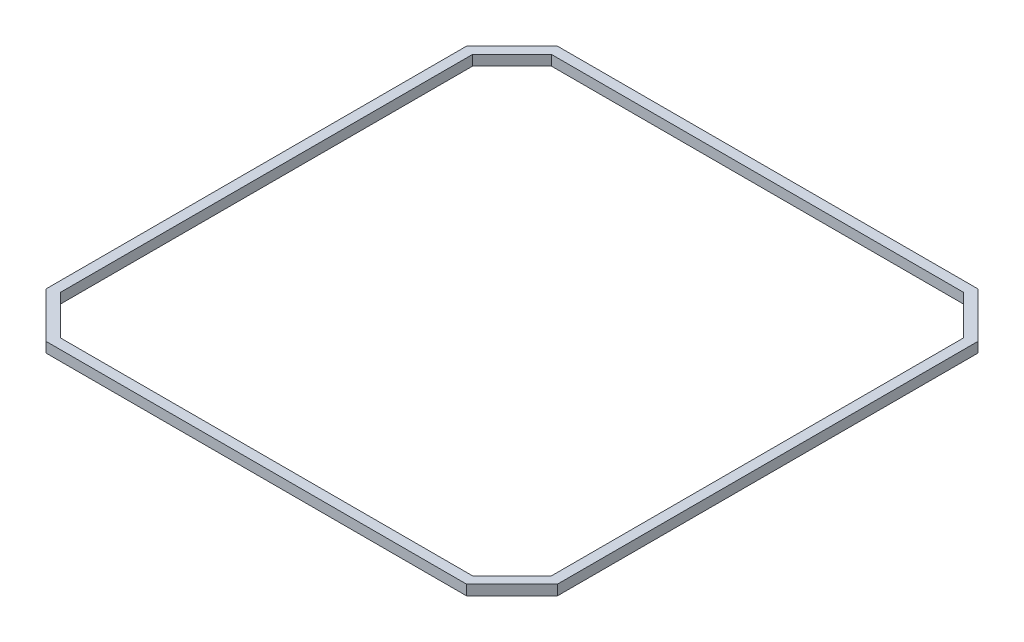
ISO-10303-21;
HEADER;
FILE_DESCRIPTION(('STEP AP214'),'2;1');
FILE_NAME('part.step','',(''),(''),'','','');
FILE_SCHEMA(('AUTOMOTIVE_DESIGN { 1 0 10303 214 1 1 1 1 }'));
ENDSEC;
DATA;
#1=APPLICATION_CONTEXT('core data for automotive mechanical design processes');
#2=APPLICATION_PROTOCOL_DEFINITION('international standard','automotive_design',2000,#1);
#3=PRODUCT_CONTEXT('',#1,'mechanical');
#4=PRODUCT('Part','Part','',(#3));
#5=PRODUCT_RELATED_PRODUCT_CATEGORY('part','',(#4));
#6=PRODUCT_DEFINITION_FORMATION('','',#4);
#7=PRODUCT_DEFINITION_CONTEXT('part definition',#1,'design');
#8=PRODUCT_DEFINITION('design','',#6,#7);
#9=PRODUCT_DEFINITION_SHAPE('','',#8);
#10=(LENGTH_UNIT() NAMED_UNIT(*) SI_UNIT(.MILLI.,.METRE.));
#11=(NAMED_UNIT(*) PLANE_ANGLE_UNIT() SI_UNIT($,.RADIAN.));
#12=(NAMED_UNIT(*) SI_UNIT($,.STERADIAN.) SOLID_ANGLE_UNIT());
#13=UNCERTAINTY_MEASURE_WITH_UNIT(LENGTH_MEASURE(1.E-05),#10,'distance_accuracy_value','');
#14=(GEOMETRIC_REPRESENTATION_CONTEXT(3) GLOBAL_UNCERTAINTY_ASSIGNED_CONTEXT((#13)) GLOBAL_UNIT_ASSIGNED_CONTEXT((#10,
#11,#12)) REPRESENTATION_CONTEXT('',''));
#15=CARTESIAN_POINT('',(0.,0.,0.));
#16=DIRECTION('',(0.,0.,1.));
#17=DIRECTION('',(1.,0.,0.));
#18=AXIS2_PLACEMENT_3D('',#15,#16,#17);
#19=CARTESIAN_POINT('',(0.,1.65,0.));
#20=DIRECTION('',(0.,1.,0.));
#21=DIRECTION('',(0.,0.,1.));
#22=AXIS2_PLACEMENT_3D('',#19,#20,#21);
#23=PLANE('',#22);
#24=DIRECTION('',(0.,0.,1.));
#25=VECTOR('',#24,1.);
#26=CARTESIAN_POINT('',(-41.448800006,1.65,-34.0917042033179));
#27=LINE('',#26,#25);
#28=CARTESIAN_POINT('',(-41.448800006,1.65,-34.0917042033179));
#29=VERTEX_POINT('',#28);
#30=CARTESIAN_POINT('',(-41.448800006,1.65,34.0917042033179));
#31=VERTEX_POINT('',#30);
#32=EDGE_CURVE('E211',#29,#31,#27,.T.);
#33=ORIENTED_EDGE('',*,*,#32,.T.);
#34=DIRECTION('',(0.707106781186548,0.,0.707106781186547));
#35=VECTOR('',#34,1.);
#36=CARTESIAN_POINT('',(-34.0917042033179,1.65,41.448800006));
#37=LINE('',#36,#35);
#38=CARTESIAN_POINT('',(-34.0917042033179,1.65,41.448800006));
#39=VERTEX_POINT('',#38);
#40=EDGE_CURVE('E214',#31,#39,#37,.T.);
#41=ORIENTED_EDGE('',*,*,#40,.T.);
#42=DIRECTION('',(1.,0.,0.));
#43=VECTOR('',#42,1.);
#44=CARTESIAN_POINT('',(-34.0917042033179,1.65,41.448800006));
#45=LINE('',#44,#43);
#46=CARTESIAN_POINT('',(34.0917042033179,1.65,41.448800006));
#47=VERTEX_POINT('',#46);
#48=EDGE_CURVE('E217',#39,#47,#45,.T.);
#49=ORIENTED_EDGE('',*,*,#48,.T.);
#50=DIRECTION('',(0.707106781186547,0.,-0.707106781186548));
#51=VECTOR('',#50,1.);
#52=CARTESIAN_POINT('',(41.448800006,1.65,34.0917042033179));
#53=LINE('',#52,#51);
#54=CARTESIAN_POINT('',(41.448800006,1.65,34.0917042033179));
#55=VERTEX_POINT('',#54);
#56=EDGE_CURVE('E219',#47,#55,#53,.T.);
#57=ORIENTED_EDGE('',*,*,#56,.T.);
#58=DIRECTION('',(0.,0.,-1.));
#59=VECTOR('',#58,1.);
#60=CARTESIAN_POINT('',(41.448800006,1.65,34.0917042033179));
#61=LINE('',#60,#59);
#62=CARTESIAN_POINT('',(41.448800006,1.65,-34.0917042033179));
#63=VERTEX_POINT('',#62);
#64=EDGE_CURVE('E221',#55,#63,#61,.T.);
#65=ORIENTED_EDGE('',*,*,#64,.T.);
#66=DIRECTION('',(-0.707106781186549,0.,-0.707106781186547));
#67=VECTOR('',#66,1.);
#68=CARTESIAN_POINT('',(34.0917042033179,1.65,-41.448800006));
#69=LINE('',#68,#67);
#70=CARTESIAN_POINT('',(34.0917042033179,1.65,-41.448800006));
#71=VERTEX_POINT('',#70);
#72=EDGE_CURVE('E223',#63,#71,#69,.T.);
#73=ORIENTED_EDGE('',*,*,#72,.T.);
#74=DIRECTION('',(-1.,0.,0.));
#75=VECTOR('',#74,1.);
#76=CARTESIAN_POINT('',(34.0917042033179,1.65,-41.448800006));
#77=LINE('',#76,#75);
#78=CARTESIAN_POINT('',(-34.0917042033179,1.65,-41.448800006));
#79=VERTEX_POINT('',#78);
#80=EDGE_CURVE('E225',#71,#79,#77,.T.);
#81=ORIENTED_EDGE('',*,*,#80,.T.);
#82=DIRECTION('',(-0.707106781186547,0.,0.707106781186549));
#83=VECTOR('',#82,1.);
#84=CARTESIAN_POINT('',(-41.448800006,1.65,-34.0917042033179));
#85=LINE('',#84,#83);
#86=EDGE_CURVE('E227',#79,#29,#85,.T.);
#87=ORIENTED_EDGE('',*,*,#86,.T.);
#88=EDGE_LOOP('',(#33,#41,#49,#57,#65,#73,#81,#87));
#89=FACE_BOUND('',#88,.T.);
#90=DIRECTION('',(0.707106781186548,0.,0.707106781186547));
#91=VECTOR('',#90,1.);
#92=CARTESIAN_POINT('',(-33.4082518254023,1.65,39.798800006));
#93=LINE('',#92,#91);
#94=CARTESIAN_POINT('',(-39.798800006,1.65,33.4082518254023));
#95=VERTEX_POINT('',#94);
#96=CARTESIAN_POINT('',(-33.4082518254023,1.65,39.798800006));
#97=VERTEX_POINT('',#96);
#98=EDGE_CURVE('E154',#95,#97,#93,.T.);
#99=ORIENTED_EDGE('',*,*,#98,.F.);
#100=DIRECTION('',(0.,0.,1.));
#101=VECTOR('',#100,1.);
#102=CARTESIAN_POINT('',(-39.798800006,1.65,33.4082518254023));
#103=LINE('',#102,#101);
#104=CARTESIAN_POINT('',(-39.798800006,1.65,-33.4082518254023));
#105=VERTEX_POINT('',#104);
#106=EDGE_CURVE('E146',#105,#95,#103,.T.);
#107=ORIENTED_EDGE('',*,*,#106,.F.);
#108=DIRECTION('',(-0.707106781186547,0.,0.707106781186548));
#109=VECTOR('',#108,1.);
#110=CARTESIAN_POINT('',(-39.798800006,1.65,-33.4082518254023));
#111=LINE('',#110,#109);
#112=CARTESIAN_POINT('',(-33.4082518254023,1.65,-39.798800006));
#113=VERTEX_POINT('',#112);
#114=EDGE_CURVE('E179',#113,#105,#111,.T.);
#115=ORIENTED_EDGE('',*,*,#114,.F.);
#116=DIRECTION('',(-1.,0.,0.));
#117=VECTOR('',#116,1.);
#118=CARTESIAN_POINT('',(-33.4082518254023,1.65,-39.798800006));
#119=LINE('',#118,#117);
#120=CARTESIAN_POINT('',(33.4082518254023,1.65,-39.798800006));
#121=VERTEX_POINT('',#120);
#122=EDGE_CURVE('E177',#121,#113,#119,.T.);
#123=ORIENTED_EDGE('',*,*,#122,.F.);
#124=DIRECTION('',(-0.707106781186548,0.,-0.707106781186547));
#125=VECTOR('',#124,1.);
#126=CARTESIAN_POINT('',(33.4082518254023,1.65,-39.798800006));
#127=LINE('',#126,#125);
#128=CARTESIAN_POINT('',(39.798800006,1.65,-33.4082518254023));
#129=VERTEX_POINT('',#128);
#130=EDGE_CURVE('E175',#129,#121,#127,.T.);
#131=ORIENTED_EDGE('',*,*,#130,.F.);
#132=DIRECTION('',(0.,0.,-1.));
#133=VECTOR('',#132,1.);
#134=CARTESIAN_POINT('',(39.798800006,1.65,33.4082518254023));
#135=LINE('',#134,#133);
#136=CARTESIAN_POINT('',(39.798800006,1.65,33.4082518254023));
#137=VERTEX_POINT('',#136);
#138=EDGE_CURVE('E173',#137,#129,#135,.T.);
#139=ORIENTED_EDGE('',*,*,#138,.F.);
#140=DIRECTION('',(0.707106781186547,0.,-0.707106781186548));
#141=VECTOR('',#140,1.);
#142=CARTESIAN_POINT('',(39.798800006,1.65,33.4082518254023));
#143=LINE('',#142,#141);
#144=CARTESIAN_POINT('',(33.4082518254023,1.65,39.798800006));
#145=VERTEX_POINT('',#144);
#146=EDGE_CURVE('E169',#145,#137,#143,.T.);
#147=ORIENTED_EDGE('',*,*,#146,.F.);
#148=DIRECTION('',(1.,0.,0.));
#149=VECTOR('',#148,1.);
#150=CARTESIAN_POINT('',(-33.4082518254023,1.65,39.798800006));
#151=LINE('',#150,#149);
#152=EDGE_CURVE('E167',#97,#145,#151,.T.);
#153=ORIENTED_EDGE('',*,*,#152,.F.);
#154=EDGE_LOOP('',(#99,#107,#115,#123,#131,#139,#147,#153));
#155=FACE_BOUND('',#154,.T.);
#156=ADVANCED_FACE('F33',(#89,#155),#23,.T.);
#157=CARTESIAN_POINT('',(0.,0.,0.));
#158=DIRECTION('',(0.,1.,0.));
#159=DIRECTION('',(0.,0.,1.));
#160=AXIS2_PLACEMENT_3D('',#157,#158,#159);
#161=PLANE('',#160);
#162=DIRECTION('',(0.,0.,1.));
#163=VECTOR('',#162,1.);
#164=CARTESIAN_POINT('',(-41.448800006,0.,-34.0917042033179));
#165=LINE('',#164,#163);
#166=CARTESIAN_POINT('',(-41.448800006,0.,-34.0917042033179));
#167=VERTEX_POINT('',#166);
#168=CARTESIAN_POINT('',(-41.448800006,0.,34.0917042033179));
#169=VERTEX_POINT('',#168);
#170=EDGE_CURVE('E162',#167,#169,#165,.T.);
#171=ORIENTED_EDGE('',*,*,#170,.F.);
#172=DIRECTION('',(-0.707106781186547,0.,0.707106781186549));
#173=VECTOR('',#172,1.);
#174=CARTESIAN_POINT('',(-41.448800006,0.,-34.0917042033179));
#175=LINE('',#174,#173);
#176=CARTESIAN_POINT('',(-34.0917042033179,0.,-41.448800006));
#177=VERTEX_POINT('',#176);
#178=EDGE_CURVE('E215',#177,#167,#175,.T.);
#179=ORIENTED_EDGE('',*,*,#178,.F.);
#180=DIRECTION('',(-1.,0.,0.));
#181=VECTOR('',#180,1.);
#182=CARTESIAN_POINT('',(34.0917042033179,0.,-41.448800006));
#183=LINE('',#182,#181);
#184=CARTESIAN_POINT('',(34.0917042033179,0.,-41.448800006));
#185=VERTEX_POINT('',#184);
#186=EDGE_CURVE('E242',#185,#177,#183,.T.);
#187=ORIENTED_EDGE('',*,*,#186,.F.);
#188=DIRECTION('',(-0.707106781186549,0.,-0.707106781186547));
#189=VECTOR('',#188,1.);
#190=CARTESIAN_POINT('',(34.0917042033179,0.,-41.448800006));
#191=LINE('',#190,#189);
#192=CARTESIAN_POINT('',(41.448800006,0.,-34.0917042033179));
#193=VERTEX_POINT('',#192);
#194=EDGE_CURVE('E240',#193,#185,#191,.T.);
#195=ORIENTED_EDGE('',*,*,#194,.F.);
#196=DIRECTION('',(0.,0.,-1.));
#197=VECTOR('',#196,1.);
#198=CARTESIAN_POINT('',(41.448800006,0.,34.0917042033179));
#199=LINE('',#198,#197);
#200=CARTESIAN_POINT('',(41.448800006,0.,34.0917042033179));
#201=VERTEX_POINT('',#200);
#202=EDGE_CURVE('E238',#201,#193,#199,.T.);
#203=ORIENTED_EDGE('',*,*,#202,.F.);
#204=DIRECTION('',(0.707106781186547,0.,-0.707106781186548));
#205=VECTOR('',#204,1.);
#206=CARTESIAN_POINT('',(41.448800006,0.,34.0917042033179));
#207=LINE('',#206,#205);
#208=CARTESIAN_POINT('',(34.0917042033179,0.,41.448800006));
#209=VERTEX_POINT('',#208);
#210=EDGE_CURVE('E236',#209,#201,#207,.T.);
#211=ORIENTED_EDGE('',*,*,#210,.F.);
#212=DIRECTION('',(1.,0.,0.));
#213=VECTOR('',#212,1.);
#214=CARTESIAN_POINT('',(-34.0917042033179,0.,41.448800006));
#215=LINE('',#214,#213);
#216=CARTESIAN_POINT('',(-34.0917042033179,0.,41.448800006));
#217=VERTEX_POINT('',#216);
#218=EDGE_CURVE('E234',#217,#209,#215,.T.);
#219=ORIENTED_EDGE('',*,*,#218,.F.);
#220=DIRECTION('',(0.707106781186548,0.,0.707106781186547));
#221=VECTOR('',#220,1.);
#222=CARTESIAN_POINT('',(-34.0917042033179,0.,41.448800006));
#223=LINE('',#222,#221);
#224=EDGE_CURVE('E232',#169,#217,#223,.T.);
#225=ORIENTED_EDGE('',*,*,#224,.F.);
#226=EDGE_LOOP('',(#171,#179,#187,#195,#203,#211,#219,#225));
#227=FACE_BOUND('',#226,.T.);
#228=DIRECTION('',(0.,0.,1.));
#229=VECTOR('',#228,1.);
#230=CARTESIAN_POINT('',(-39.798800006,0.,33.4082518254023));
#231=LINE('',#230,#229);
#232=CARTESIAN_POINT('',(-39.798800006,0.,-33.4082518254023));
#233=VERTEX_POINT('',#232);
#234=CARTESIAN_POINT('',(-39.798800006,0.,33.4082518254023));
#235=VERTEX_POINT('',#234);
#236=EDGE_CURVE('E56',#233,#235,#231,.T.);
#237=ORIENTED_EDGE('',*,*,#236,.T.);
#238=DIRECTION('',(0.707106781186548,0.,0.707106781186547));
#239=VECTOR('',#238,1.);
#240=CARTESIAN_POINT('',(-33.4082518254023,0.,39.798800006));
#241=LINE('',#240,#239);
#242=CARTESIAN_POINT('',(-33.4082518254023,0.,39.798800006));
#243=VERTEX_POINT('',#242);
#244=EDGE_CURVE('E161',#235,#243,#241,.T.);
#245=ORIENTED_EDGE('',*,*,#244,.T.);
#246=DIRECTION('',(1.,0.,0.));
#247=VECTOR('',#246,1.);
#248=CARTESIAN_POINT('',(-33.4082518254023,0.,39.798800006));
#249=LINE('',#248,#247);
#250=CARTESIAN_POINT('',(33.4082518254023,0.,39.798800006));
#251=VERTEX_POINT('',#250);
#252=EDGE_CURVE('E183',#243,#251,#249,.T.);
#253=ORIENTED_EDGE('',*,*,#252,.T.);
#254=DIRECTION('',(0.707106781186547,0.,-0.707106781186548));
#255=VECTOR('',#254,1.);
#256=CARTESIAN_POINT('',(39.798800006,0.,33.4082518254023));
#257=LINE('',#256,#255);
#258=CARTESIAN_POINT('',(39.798800006,0.,33.4082518254023));
#259=VERTEX_POINT('',#258);
#260=EDGE_CURVE('E186',#251,#259,#257,.T.);
#261=ORIENTED_EDGE('',*,*,#260,.T.);
#262=DIRECTION('',(0.,0.,-1.));
#263=VECTOR('',#262,1.);
#264=CARTESIAN_POINT('',(39.798800006,0.,33.4082518254023));
#265=LINE('',#264,#263);
#266=CARTESIAN_POINT('',(39.798800006,0.,-33.4082518254023));
#267=VERTEX_POINT('',#266);
#268=EDGE_CURVE('E189',#259,#267,#265,.T.);
#269=ORIENTED_EDGE('',*,*,#268,.T.);
#270=DIRECTION('',(-0.707106781186548,0.,-0.707106781186547));
#271=VECTOR('',#270,1.);
#272=CARTESIAN_POINT('',(33.4082518254023,0.,-39.798800006));
#273=LINE('',#272,#271);
#274=CARTESIAN_POINT('',(33.4082518254023,0.,-39.798800006));
#275=VERTEX_POINT('',#274);
#276=EDGE_CURVE('E192',#267,#275,#273,.T.);
#277=ORIENTED_EDGE('',*,*,#276,.T.);
#278=DIRECTION('',(-1.,0.,0.));
#279=VECTOR('',#278,1.);
#280=CARTESIAN_POINT('',(-33.4082518254023,0.,-39.798800006));
#281=LINE('',#280,#279);
#282=CARTESIAN_POINT('',(-33.4082518254023,0.,-39.798800006));
#283=VERTEX_POINT('',#282);
#284=EDGE_CURVE('E195',#275,#283,#281,.T.);
#285=ORIENTED_EDGE('',*,*,#284,.T.);
#286=DIRECTION('',(-0.707106781186547,0.,0.707106781186548));
#287=VECTOR('',#286,1.);
#288=CARTESIAN_POINT('',(-39.798800006,0.,-33.4082518254023));
#289=LINE('',#288,#287);
#290=EDGE_CURVE('E155',#283,#233,#289,.T.);
#291=ORIENTED_EDGE('',*,*,#290,.T.);
#292=EDGE_LOOP('',(#237,#245,#253,#261,#269,#277,#285,#291));
#293=FACE_BOUND('',#292,.T.);
#294=ADVANCED_FACE('F272',(#227,#293),#161,.F.);
#295=CARTESIAN_POINT('',(-41.448800006,1.65,-34.0917042033179));
#296=DIRECTION('',(1.,0.,0.));
#297=DIRECTION('',(0.,0.,-1.));
#298=AXIS2_PLACEMENT_3D('',#295,#296,#297);
#299=PLANE('',#298);
#300=ORIENTED_EDGE('',*,*,#170,.T.);
#301=DIRECTION('',(0.,-1.,0.));
#302=VECTOR('',#301,1.);
#303=CARTESIAN_POINT('',(-41.448800006,1.65,34.0917042033179));
#304=LINE('',#303,#302);
#305=EDGE_CURVE('E11',#31,#169,#304,.T.);
#306=ORIENTED_EDGE('',*,*,#305,.F.);
#307=ORIENTED_EDGE('',*,*,#32,.F.);
#308=DIRECTION('',(0.,-1.,0.));
#309=VECTOR('',#308,1.);
#310=CARTESIAN_POINT('',(-41.448800006,1.65,-34.0917042033179));
#311=LINE('',#310,#309);
#312=EDGE_CURVE('E229',#29,#167,#311,.T.);
#313=ORIENTED_EDGE('',*,*,#312,.T.);
#314=EDGE_LOOP('',(#300,#306,#307,#313));
#315=FACE_BOUND('',#314,.T.);
#316=ADVANCED_FACE('F35',(#315),#299,.F.);
#317=CARTESIAN_POINT('',(-34.0917042033179,1.65,41.448800006));
#318=DIRECTION('',(0.707106781186547,0.,-0.707106781186548));
#319=DIRECTION('',(-0.707106781186548,0.,-0.707106781186547));
#320=AXIS2_PLACEMENT_3D('',#317,#318,#319);
#321=PLANE('',#320);
#322=ORIENTED_EDGE('',*,*,#224,.T.);
#323=DIRECTION('',(0.,-1.,0.));
#324=VECTOR('',#323,1.);
#325=CARTESIAN_POINT('',(-34.0917042033179,1.65,41.448800006));
#326=LINE('',#325,#324);
#327=EDGE_CURVE('E41',#39,#217,#326,.T.);
#328=ORIENTED_EDGE('',*,*,#327,.F.);
#329=ORIENTED_EDGE('',*,*,#40,.F.);
#330=ORIENTED_EDGE('',*,*,#305,.T.);
#331=EDGE_LOOP('',(#322,#328,#329,#330));
#332=FACE_BOUND('',#331,.T.);
#333=ADVANCED_FACE('F289',(#332),#321,.F.);
#334=CARTESIAN_POINT('',(-34.0917042033179,1.65,41.448800006));
#335=DIRECTION('',(0.,0.,-1.));
#336=DIRECTION('',(-1.,0.,0.));
#337=AXIS2_PLACEMENT_3D('',#334,#335,#336);
#338=PLANE('',#337);
#339=ORIENTED_EDGE('',*,*,#218,.T.);
#340=DIRECTION('',(0.,-1.,0.));
#341=VECTOR('',#340,1.);
#342=CARTESIAN_POINT('',(34.0917042033179,1.65,41.448800006));
#343=LINE('',#342,#341);
#344=EDGE_CURVE('E259',#47,#209,#343,.T.);
#345=ORIENTED_EDGE('',*,*,#344,.F.);
#346=ORIENTED_EDGE('',*,*,#48,.F.);
#347=ORIENTED_EDGE('',*,*,#327,.T.);
#348=EDGE_LOOP('',(#339,#345,#346,#347));
#349=FACE_BOUND('',#348,.T.);
#350=ADVANCED_FACE('F266',(#349),#338,.F.);
#351=CARTESIAN_POINT('',(41.448800006,1.65,34.0917042033179));
#352=DIRECTION('',(-0.707106781186548,0.,-0.707106781186547));
#353=DIRECTION('',(-0.707106781186547,0.,0.707106781186548));
#354=AXIS2_PLACEMENT_3D('',#351,#352,#353);
#355=PLANE('',#354);
#356=ORIENTED_EDGE('',*,*,#210,.T.);
#357=DIRECTION('',(0.,-1.,0.));
#358=VECTOR('',#357,1.);
#359=CARTESIAN_POINT('',(41.448800006,1.65,34.0917042033179));
#360=LINE('',#359,#358);
#361=EDGE_CURVE('E256',#55,#201,#360,.T.);
#362=ORIENTED_EDGE('',*,*,#361,.F.);
#363=ORIENTED_EDGE('',*,*,#56,.F.);
#364=ORIENTED_EDGE('',*,*,#344,.T.);
#365=EDGE_LOOP('',(#356,#362,#363,#364));
#366=FACE_BOUND('',#365,.T.);
#367=ADVANCED_FACE('F278',(#366),#355,.F.);
#368=CARTESIAN_POINT('',(41.448800006,1.65,34.0917042033179));
#369=DIRECTION('',(-1.,0.,0.));
#370=DIRECTION('',(0.,0.,1.));
#371=AXIS2_PLACEMENT_3D('',#368,#369,#370);
#372=PLANE('',#371);
#373=ORIENTED_EDGE('',*,*,#202,.T.);
#374=DIRECTION('',(0.,-1.,0.));
#375=VECTOR('',#374,1.);
#376=CARTESIAN_POINT('',(41.448800006,1.65,-34.0917042033179));
#377=LINE('',#376,#375);
#378=EDGE_CURVE('E253',#63,#193,#377,.T.);
#379=ORIENTED_EDGE('',*,*,#378,.F.);
#380=ORIENTED_EDGE('',*,*,#64,.F.);
#381=ORIENTED_EDGE('',*,*,#361,.T.);
#382=EDGE_LOOP('',(#373,#379,#380,#381));
#383=FACE_BOUND('',#382,.T.);
#384=ADVANCED_FACE('F282',(#383),#372,.F.);
#385=CARTESIAN_POINT('',(34.0917042033179,1.65,-41.448800006));
#386=DIRECTION('',(-0.707106781186547,0.,0.707106781186549));
#387=DIRECTION('',(0.707106781186549,0.,0.707106781186546));
#388=AXIS2_PLACEMENT_3D('',#385,#386,#387);
#389=PLANE('',#388);
#390=ORIENTED_EDGE('',*,*,#194,.T.);
#391=DIRECTION('',(0.,-1.,0.));
#392=VECTOR('',#391,1.);
#393=CARTESIAN_POINT('',(34.0917042033179,1.65,-41.448800006));
#394=LINE('',#393,#392);
#395=EDGE_CURVE('E250',#71,#185,#394,.T.);
#396=ORIENTED_EDGE('',*,*,#395,.F.);
#397=ORIENTED_EDGE('',*,*,#72,.F.);
#398=ORIENTED_EDGE('',*,*,#378,.T.);
#399=EDGE_LOOP('',(#390,#396,#397,#398));
#400=FACE_BOUND('',#399,.T.);
#401=ADVANCED_FACE('F302',(#400),#389,.F.);
#402=CARTESIAN_POINT('',(34.0917042033179,1.65,-41.448800006));
#403=DIRECTION('',(0.,0.,1.));
#404=DIRECTION('',(1.,0.,0.));
#405=AXIS2_PLACEMENT_3D('',#402,#403,#404);
#406=PLANE('',#405);
#407=ORIENTED_EDGE('',*,*,#186,.T.);
#408=DIRECTION('',(0.,-1.,0.));
#409=VECTOR('',#408,1.);
#410=CARTESIAN_POINT('',(-34.0917042033179,1.65,-41.448800006));
#411=LINE('',#410,#409);
#412=EDGE_CURVE('E247',#79,#177,#411,.T.);
#413=ORIENTED_EDGE('',*,*,#412,.F.);
#414=ORIENTED_EDGE('',*,*,#80,.F.);
#415=ORIENTED_EDGE('',*,*,#395,.T.);
#416=EDGE_LOOP('',(#407,#413,#414,#415));
#417=FACE_BOUND('',#416,.T.);
#418=ADVANCED_FACE('F300',(#417),#406,.F.);
#419=CARTESIAN_POINT('',(-41.448800006,1.65,-34.0917042033179));
#420=DIRECTION('',(0.707106781186549,0.,0.707106781186547));
#421=DIRECTION('',(0.707106781186546,0.,-0.707106781186549));
#422=AXIS2_PLACEMENT_3D('',#419,#420,#421);
#423=PLANE('',#422);
#424=ORIENTED_EDGE('',*,*,#178,.T.);
#425=ORIENTED_EDGE('',*,*,#312,.F.);
#426=ORIENTED_EDGE('',*,*,#86,.F.);
#427=ORIENTED_EDGE('',*,*,#412,.T.);
#428=EDGE_LOOP('',(#424,#425,#426,#427));
#429=FACE_BOUND('',#428,.T.);
#430=ADVANCED_FACE('F295',(#429),#423,.F.);
#431=CARTESIAN_POINT('',(-39.798800006,1.65,33.4082518254023));
#432=DIRECTION('',(1.,0.,0.));
#433=DIRECTION('',(0.,0.,-1.));
#434=AXIS2_PLACEMENT_3D('',#431,#432,#433);
#435=PLANE('',#434);
#436=ORIENTED_EDGE('',*,*,#236,.F.);
#437=DIRECTION('',(0.,-1.,0.));
#438=VECTOR('',#437,1.);
#439=CARTESIAN_POINT('',(-39.798800006,1.65,-33.4082518254023));
#440=LINE('',#439,#438);
#441=EDGE_CURVE('E150',#105,#233,#440,.T.);
#442=ORIENTED_EDGE('',*,*,#441,.F.);
#443=ORIENTED_EDGE('',*,*,#106,.T.);
#444=DIRECTION('',(0.,-1.,0.));
#445=VECTOR('',#444,1.);
#446=CARTESIAN_POINT('',(-39.798800006,1.65,33.4082518254023));
#447=LINE('',#446,#445);
#448=EDGE_CURVE('E149',#95,#235,#447,.T.);
#449=ORIENTED_EDGE('',*,*,#448,.T.);
#450=EDGE_LOOP('',(#436,#442,#443,#449));
#451=FACE_BOUND('',#450,.T.);
#452=ADVANCED_FACE('F148',(#451),#435,.T.);
#453=CARTESIAN_POINT('',(-33.4082518254023,1.65,39.798800006));
#454=DIRECTION('',(0.707106781186547,0.,-0.707106781186548));
#455=DIRECTION('',(-0.707106781186548,0.,-0.707106781186547));
#456=AXIS2_PLACEMENT_3D('',#453,#454,#455);
#457=PLANE('',#456);
#458=ORIENTED_EDGE('',*,*,#244,.F.);
#459=ORIENTED_EDGE('',*,*,#448,.F.);
#460=ORIENTED_EDGE('',*,*,#98,.T.);
#461=DIRECTION('',(0.,-1.,0.));
#462=VECTOR('',#461,1.);
#463=CARTESIAN_POINT('',(-33.4082518254023,1.65,39.798800006));
#464=LINE('',#463,#462);
#465=EDGE_CURVE('E163',#97,#243,#464,.T.);
#466=ORIENTED_EDGE('',*,*,#465,.T.);
#467=EDGE_LOOP('',(#458,#459,#460,#466));
#468=FACE_BOUND('',#467,.T.);
#469=ADVANCED_FACE('F158',(#468),#457,.T.);
#470=CARTESIAN_POINT('',(-33.4082518254023,1.65,39.798800006));
#471=DIRECTION('',(0.,0.,-1.));
#472=DIRECTION('',(-1.,0.,0.));
#473=AXIS2_PLACEMENT_3D('',#470,#471,#472);
#474=PLANE('',#473);
#475=ORIENTED_EDGE('',*,*,#252,.F.);
#476=ORIENTED_EDGE('',*,*,#465,.F.);
#477=ORIENTED_EDGE('',*,*,#152,.T.);
#478=DIRECTION('',(0.,-1.,0.));
#479=VECTOR('',#478,1.);
#480=CARTESIAN_POINT('',(33.4082518254023,1.65,39.798800006));
#481=LINE('',#480,#479);
#482=EDGE_CURVE('E208',#145,#251,#481,.T.);
#483=ORIENTED_EDGE('',*,*,#482,.T.);
#484=EDGE_LOOP('',(#475,#476,#477,#483));
#485=FACE_BOUND('',#484,.T.);
#486=ADVANCED_FACE('F327',(#485),#474,.T.);
#487=CARTESIAN_POINT('',(39.798800006,1.65,33.4082518254023));
#488=DIRECTION('',(-0.707106781186548,0.,-0.707106781186547));
#489=DIRECTION('',(-0.707106781186547,0.,0.707106781186548));
#490=AXIS2_PLACEMENT_3D('',#487,#488,#489);
#491=PLANE('',#490);
#492=ORIENTED_EDGE('',*,*,#260,.F.);
#493=ORIENTED_EDGE('',*,*,#482,.F.);
#494=ORIENTED_EDGE('',*,*,#146,.T.);
#495=DIRECTION('',(0.,-1.,0.));
#496=VECTOR('',#495,1.);
#497=CARTESIAN_POINT('',(39.798800006,1.65,33.4082518254023));
#498=LINE('',#497,#496);
#499=EDGE_CURVE('E206',#137,#259,#498,.T.);
#500=ORIENTED_EDGE('',*,*,#499,.T.);
#501=EDGE_LOOP('',(#492,#493,#494,#500));
#502=FACE_BOUND('',#501,.T.);
#503=ADVANCED_FACE('F331',(#502),#491,.T.);
#504=CARTESIAN_POINT('',(39.798800006,1.65,33.4082518254023));
#505=DIRECTION('',(-1.,0.,0.));
#506=DIRECTION('',(0.,0.,1.));
#507=AXIS2_PLACEMENT_3D('',#504,#505,#506);
#508=PLANE('',#507);
#509=ORIENTED_EDGE('',*,*,#268,.F.);
#510=ORIENTED_EDGE('',*,*,#499,.F.);
#511=ORIENTED_EDGE('',*,*,#138,.T.);
#512=DIRECTION('',(0.,-1.,0.));
#513=VECTOR('',#512,1.);
#514=CARTESIAN_POINT('',(39.798800006,1.65,-33.4082518254023));
#515=LINE('',#514,#513);
#516=EDGE_CURVE('E204',#129,#267,#515,.T.);
#517=ORIENTED_EDGE('',*,*,#516,.T.);
#518=EDGE_LOOP('',(#509,#510,#511,#517));
#519=FACE_BOUND('',#518,.T.);
#520=ADVANCED_FACE('F337',(#519),#508,.T.);
#521=CARTESIAN_POINT('',(33.4082518254023,1.65,-39.798800006));
#522=DIRECTION('',(-0.707106781186547,0.,0.707106781186548));
#523=DIRECTION('',(0.707106781186548,0.,0.707106781186547));
#524=AXIS2_PLACEMENT_3D('',#521,#522,#523);
#525=PLANE('',#524);
#526=ORIENTED_EDGE('',*,*,#276,.F.);
#527=ORIENTED_EDGE('',*,*,#516,.F.);
#528=ORIENTED_EDGE('',*,*,#130,.T.);
#529=DIRECTION('',(0.,-1.,0.));
#530=VECTOR('',#529,1.);
#531=CARTESIAN_POINT('',(33.4082518254023,1.65,-39.798800006));
#532=LINE('',#531,#530);
#533=EDGE_CURVE('E202',#121,#275,#532,.T.);
#534=ORIENTED_EDGE('',*,*,#533,.T.);
#535=EDGE_LOOP('',(#526,#527,#528,#534));
#536=FACE_BOUND('',#535,.T.);
#537=ADVANCED_FACE('F341',(#536),#525,.T.);
#538=CARTESIAN_POINT('',(-33.4082518254023,1.65,-39.798800006));
#539=DIRECTION('',(0.,0.,1.));
#540=DIRECTION('',(1.,0.,0.));
#541=AXIS2_PLACEMENT_3D('',#538,#539,#540);
#542=PLANE('',#541);
#543=ORIENTED_EDGE('',*,*,#284,.F.);
#544=ORIENTED_EDGE('',*,*,#533,.F.);
#545=ORIENTED_EDGE('',*,*,#122,.T.);
#546=DIRECTION('',(0.,-1.,0.));
#547=VECTOR('',#546,1.);
#548=CARTESIAN_POINT('',(-33.4082518254023,1.65,-39.798800006));
#549=LINE('',#548,#547);
#550=EDGE_CURVE('E48',#113,#283,#549,.T.);
#551=ORIENTED_EDGE('',*,*,#550,.T.);
#552=EDGE_LOOP('',(#543,#544,#545,#551));
#553=FACE_BOUND('',#552,.T.);
#554=ADVANCED_FACE('F345',(#553),#542,.T.);
#555=CARTESIAN_POINT('',(-39.798800006,1.65,-33.4082518254023));
#556=DIRECTION('',(0.707106781186548,0.,0.707106781186547));
#557=DIRECTION('',(0.707106781186547,0.,-0.707106781186548));
#558=AXIS2_PLACEMENT_3D('',#555,#556,#557);
#559=PLANE('',#558);
#560=ORIENTED_EDGE('',*,*,#290,.F.);
#561=ORIENTED_EDGE('',*,*,#550,.F.);
#562=ORIENTED_EDGE('',*,*,#114,.T.);
#563=ORIENTED_EDGE('',*,*,#441,.T.);
#564=EDGE_LOOP('',(#560,#561,#562,#563));
#565=FACE_BOUND('',#564,.T.);
#566=ADVANCED_FACE('F349',(#565),#559,.T.);
#567=CLOSED_SHELL('',(#156,#294,#316,#333,#350,#367,#384,#401,#418,#430,#452,#469,#486,#503,
#520,#537,#554,#566));
#568=MANIFOLD_SOLID_BREP('B2',#567);
#569=ADVANCED_BREP_SHAPE_REPRESENTATION('',(#18,#568),#14);
#570=SHAPE_DEFINITION_REPRESENTATION(#9,#569);
ENDSEC;
END-ISO-10303-21;
